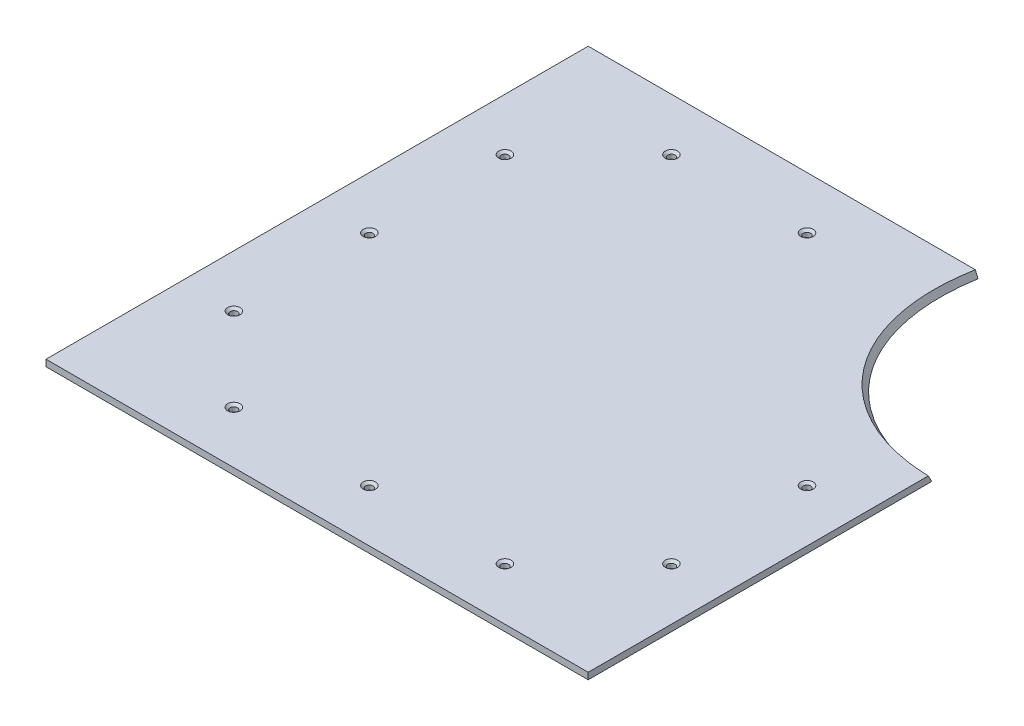
ISO-10303-21;
HEADER;
FILE_DESCRIPTION(('STEP AP214'),'2;1');
FILE_NAME('part.step','',(''),(''),'','','');
FILE_SCHEMA(('AUTOMOTIVE_DESIGN { 1 0 10303 214 1 1 1 1 }'));
ENDSEC;
DATA;
#1=APPLICATION_CONTEXT('core data for automotive mechanical design processes');
#2=APPLICATION_PROTOCOL_DEFINITION('international standard','automotive_design',2000,#1);
#3=PRODUCT_CONTEXT('',#1,'mechanical');
#4=PRODUCT('Part','Part','',(#3));
#5=PRODUCT_RELATED_PRODUCT_CATEGORY('part','',(#4));
#6=PRODUCT_DEFINITION_FORMATION('','',#4);
#7=PRODUCT_DEFINITION_CONTEXT('part definition',#1,'design');
#8=PRODUCT_DEFINITION('design','',#6,#7);
#9=PRODUCT_DEFINITION_SHAPE('','',#8);
#10=(LENGTH_UNIT() NAMED_UNIT(*) SI_UNIT(.MILLI.,.METRE.));
#11=(NAMED_UNIT(*) PLANE_ANGLE_UNIT() SI_UNIT($,.RADIAN.));
#12=(NAMED_UNIT(*) SI_UNIT($,.STERADIAN.) SOLID_ANGLE_UNIT());
#13=UNCERTAINTY_MEASURE_WITH_UNIT(LENGTH_MEASURE(1.E-05),#10,'distance_accuracy_value','');
#14=(GEOMETRIC_REPRESENTATION_CONTEXT(3) GLOBAL_UNCERTAINTY_ASSIGNED_CONTEXT((#13)) GLOBAL_UNIT_ASSIGNED_CONTEXT((#10,
#11,#12)) REPRESENTATION_CONTEXT('',''));
#15=CARTESIAN_POINT('',(0.,0.,0.));
#16=DIRECTION('',(0.,0.,1.));
#17=DIRECTION('',(1.,0.,0.));
#18=AXIS2_PLACEMENT_3D('',#15,#16,#17);
#19=CARTESIAN_POINT('',(65.821179,76.933679,65.821179));
#20=DIRECTION('',(1.,0.,0.));
#21=DIRECTION('',(0.,0.,1.));
#22=AXIS2_PLACEMENT_3D('',#19,#20,#21);
#23=PLANE('',#22);
#24=CARTESIAN_POINT('',(65.821179,99.3686619114965,-55.2144094068485));
#25=DIRECTION('',(1.,0.,0.));
#26=DIRECTION('',(0.,-0.892228166379723,-0.451584874767388));
#27=AXIS2_PLACEMENT_3D('',#24,#25,#26);
#28=ELLIPSE('',#27,110.282499709764,44.45);
#29=CARTESIAN_POINT('',(65.821179,76.933679,-16.7647949382659));
#30=VERTEX_POINT('',#29);
#31=CARTESIAN_POINT('',(65.821179,75.346179,-17.5943327986421));
#32=VERTEX_POINT('',#31);
#33=EDGE_CURVE('E46',#30,#32,#28,.T.);
#34=ORIENTED_EDGE('',*,*,#33,.F.);
#35=DIRECTION('',(0.,0.,1.));
#36=VECTOR('',#35,1.);
#37=CARTESIAN_POINT('',(65.821179,76.933679,65.821179));
#38=LINE('',#37,#36);
#39=CARTESIAN_POINT('',(65.821179,76.933679,65.821179));
#40=VERTEX_POINT('',#39);
#41=EDGE_CURVE('E74',#30,#40,#38,.T.);
#42=ORIENTED_EDGE('',*,*,#41,.T.);
#43=DIRECTION('',(0.,-1.,0.));
#44=VECTOR('',#43,1.);
#45=CARTESIAN_POINT('',(65.821179,76.933679,65.821179));
#46=LINE('',#45,#44);
#47=CARTESIAN_POINT('',(65.821179,75.346179,65.821179));
#48=VERTEX_POINT('',#47);
#49=EDGE_CURVE('E106',#40,#48,#46,.T.);
#50=ORIENTED_EDGE('',*,*,#49,.T.);
#51=DIRECTION('',(0.,0.,1.));
#52=VECTOR('',#51,1.);
#53=CARTESIAN_POINT('',(65.821179,75.346179,65.821179));
#54=LINE('',#53,#52);
#55=EDGE_CURVE('E113',#32,#48,#54,.T.);
#56=ORIENTED_EDGE('',*,*,#55,.F.);
#57=EDGE_LOOP('',(#34,#42,#50,#56));
#58=FACE_BOUND('',#57,.T.);
#59=ADVANCED_FACE('F32',(#58),#23,.T.);
#60=CARTESIAN_POINT('',(65.821179,76.933679,-65.821179));
#61=DIRECTION('',(0.,0.,-1.));
#62=DIRECTION('',(1.,0.,0.));
#63=AXIS2_PLACEMENT_3D('',#60,#61,#62);
#64=PLANE('',#63);
#65=CARTESIAN_POINT('',(76.165561457065,78.4121172748222,-65.821179));
#66=DIRECTION('',(0.,0.,-1.));
#67=DIRECTION('',(0.442624526559217,-0.896707047194472,0.));
#68=AXIS2_PLACEMENT_3D('',#65,#66,#67);
#69=ELLIPSE('',#68,107.554363776842,44.45);
#70=CARTESIAN_POINT('',(28.8239635311147,75.346179,-65.821179));
#71=VERTEX_POINT('',#70);
#72=CARTESIAN_POINT('',(28.1820681832988,76.933679,-65.821179));
#73=VERTEX_POINT('',#72);
#74=EDGE_CURVE('E84',#71,#73,#69,.T.);
#75=ORIENTED_EDGE('',*,*,#74,.F.);
#76=DIRECTION('',(1.,0.,0.));
#77=VECTOR('',#76,1.);
#78=CARTESIAN_POINT('',(65.821179,75.346179,-65.821179));
#79=LINE('',#78,#77);
#80=CARTESIAN_POINT('',(-65.821179,75.346179,-65.821179));
#81=VERTEX_POINT('',#80);
#82=EDGE_CURVE('E90',#81,#71,#79,.T.);
#83=ORIENTED_EDGE('',*,*,#82,.F.);
#84=DIRECTION('',(0.,-1.,0.));
#85=VECTOR('',#84,1.);
#86=CARTESIAN_POINT('',(-65.821179,76.933679,-65.821179));
#87=LINE('',#86,#85);
#88=CARTESIAN_POINT('',(-65.821179,76.933679,-65.821179));
#89=VERTEX_POINT('',#88);
#90=EDGE_CURVE('E39',#89,#81,#87,.T.);
#91=ORIENTED_EDGE('',*,*,#90,.F.);
#92=DIRECTION('',(1.,0.,0.));
#93=VECTOR('',#92,1.);
#94=CARTESIAN_POINT('',(65.821179,76.933679,-65.821179));
#95=LINE('',#94,#93);
#96=EDGE_CURVE('E92',#89,#73,#95,.T.);
#97=ORIENTED_EDGE('',*,*,#96,.T.);
#98=EDGE_LOOP('',(#75,#83,#91,#97));
#99=FACE_BOUND('',#98,.T.);
#100=ADVANCED_FACE('F89',(#99),#64,.T.);
#101=CARTESIAN_POINT('',(-65.821179,76.933679,65.821179));
#102=DIRECTION('',(-1.,0.,0.));
#103=DIRECTION('',(0.,0.,-1.));
#104=AXIS2_PLACEMENT_3D('',#101,#102,#103);
#105=PLANE('',#104);
#106=DIRECTION('',(0.,0.,-1.));
#107=VECTOR('',#106,1.);
#108=CARTESIAN_POINT('',(-65.821179,75.346179,65.821179));
#109=LINE('',#108,#107);
#110=CARTESIAN_POINT('',(-65.821179,75.346179,65.821179));
#111=VERTEX_POINT('',#110);
#112=EDGE_CURVE('E96',#111,#81,#109,.T.);
#113=ORIENTED_EDGE('',*,*,#112,.F.);
#114=DIRECTION('',(0.,-1.,0.));
#115=VECTOR('',#114,1.);
#116=CARTESIAN_POINT('',(-65.821179,76.933679,65.821179));
#117=LINE('',#116,#115);
#118=CARTESIAN_POINT('',(-65.821179,76.933679,65.821179));
#119=VERTEX_POINT('',#118);
#120=EDGE_CURVE('E105',#119,#111,#117,.T.);
#121=ORIENTED_EDGE('',*,*,#120,.F.);
#122=DIRECTION('',(0.,0.,-1.));
#123=VECTOR('',#122,1.);
#124=CARTESIAN_POINT('',(-65.821179,76.933679,65.821179));
#125=LINE('',#124,#123);
#126=EDGE_CURVE('E108',#119,#89,#125,.T.);
#127=ORIENTED_EDGE('',*,*,#126,.T.);
#128=ORIENTED_EDGE('',*,*,#90,.T.);
#129=EDGE_LOOP('',(#113,#121,#127,#128));
#130=FACE_BOUND('',#129,.T.);
#131=ADVANCED_FACE('F120',(#130),#105,.T.);
#132=CARTESIAN_POINT('',(65.821179,76.933679,65.821179));
#133=DIRECTION('',(0.,0.,1.));
#134=DIRECTION('',(-1.,0.,0.));
#135=AXIS2_PLACEMENT_3D('',#132,#133,#134);
#136=PLANE('',#135);
#137=DIRECTION('',(-1.,0.,0.));
#138=VECTOR('',#137,1.);
#139=CARTESIAN_POINT('',(65.821179,75.346179,65.821179));
#140=LINE('',#139,#138);
#141=EDGE_CURVE('E100',#48,#111,#140,.T.);
#142=ORIENTED_EDGE('',*,*,#141,.F.);
#143=ORIENTED_EDGE('',*,*,#49,.F.);
#144=DIRECTION('',(-1.,0.,0.));
#145=VECTOR('',#144,1.);
#146=CARTESIAN_POINT('',(65.821179,76.933679,65.821179));
#147=LINE('',#146,#145);
#148=EDGE_CURVE('E98',#40,#119,#147,.T.);
#149=ORIENTED_EDGE('',*,*,#148,.T.);
#150=ORIENTED_EDGE('',*,*,#120,.T.);
#151=EDGE_LOOP('',(#142,#143,#149,#150));
#152=FACE_BOUND('',#151,.T.);
#153=ADVANCED_FACE('F116',(#152),#136,.T.);
#154=CARTESIAN_POINT('',(65.821179,76.933679,-65.821179));
#155=DIRECTION('',(0.,1.,0.));
#156=DIRECTION('',(0.,0.,-1.));
#157=AXIS2_PLACEMENT_3D('',#154,#155,#156);
#158=PLANE('',#157);
#159=CARTESIAN_POINT('',(76.8953349583302,76.933679,-66.5694633384063));
#160=DIRECTION('',(0.,1.,0.));
#161=DIRECTION('',(0.698196395740358,0.,-0.715906273876108));
#162=AXIS2_PLACEMENT_3D('',#159,#160,#161);
#163=ELLIPSE('',#162,54.4366628705828,44.45);
#164=EDGE_CURVE('E132',#73,#30,#163,.T.);
#165=ORIENTED_EDGE('',*,*,#164,.F.);
#166=ORIENTED_EDGE('',*,*,#96,.F.);
#167=ORIENTED_EDGE('',*,*,#126,.F.);
#168=ORIENTED_EDGE('',*,*,#148,.F.);
#169=ORIENTED_EDGE('',*,*,#41,.F.);
#170=EDGE_LOOP('',(#165,#166,#167,#168,#169));
#171=FACE_BOUND('',#170,.T.);
#172=CARTESIAN_POINT('',(-53.1211790000003,76.933679,32.9105894999995));
#173=DIRECTION('',(0.,1.,0.));
#174=DIRECTION('',(0.,0.,-1.));
#175=AXIS2_PLACEMENT_3D('',#172,#173,#174);
#176=CIRCLE('',#175,1.5113);
#177=CARTESIAN_POINT('',(-53.1211790000003,76.933679,31.3992894999995));
#178=VERTEX_POINT('',#177);
#179=EDGE_CURVE('E223',#178,#178,#176,.T.);
#180=ORIENTED_EDGE('',*,*,#179,.F.);
#181=EDGE_LOOP('',(#180));
#182=FACE_BOUND('',#181,.T.);
#183=CARTESIAN_POINT('',(-53.121179,76.933679,-5.54508773728232E-13));
#184=DIRECTION('',(0.,1.,0.));
#185=DIRECTION('',(0.,0.,-1.));
#186=AXIS2_PLACEMENT_3D('',#183,#184,#185);
#187=CIRCLE('',#186,1.5113);
#188=CARTESIAN_POINT('',(-53.121179,76.933679,-1.51130000000055));
#189=VERTEX_POINT('',#188);
#190=EDGE_CURVE('E214',#189,#189,#187,.T.);
#191=ORIENTED_EDGE('',*,*,#190,.F.);
#192=EDGE_LOOP('',(#191));
#193=FACE_BOUND('',#192,.T.);
#194=CARTESIAN_POINT('',(-53.1211789999996,76.933679,-32.9105895000006));
#195=DIRECTION('',(0.,1.,0.));
#196=DIRECTION('',(0.,0.,-1.));
#197=AXIS2_PLACEMENT_3D('',#194,#195,#196);
#198=CIRCLE('',#197,1.5113);
#199=CARTESIAN_POINT('',(-53.1211789999996,76.933679,-34.4218895000006));
#200=VERTEX_POINT('',#199);
#201=EDGE_CURVE('E205',#200,#200,#198,.T.);
#202=ORIENTED_EDGE('',*,*,#201,.F.);
#203=EDGE_LOOP('',(#202));
#204=FACE_BOUND('',#203,.T.);
#205=CARTESIAN_POINT('',(32.9105894999996,76.933679,53.1211790000002));
#206=DIRECTION('',(0.,1.,0.));
#207=DIRECTION('',(0.,0.,-1.));
#208=AXIS2_PLACEMENT_3D('',#205,#206,#207);
#209=CIRCLE('',#208,1.5113);
#210=CARTESIAN_POINT('',(32.9105894999996,76.933679,51.6098790000002));
#211=VERTEX_POINT('',#210);
#212=EDGE_CURVE('E196',#211,#211,#209,.T.);
#213=ORIENTED_EDGE('',*,*,#212,.F.);
#214=EDGE_LOOP('',(#213));
#215=FACE_BOUND('',#214,.T.);
#216=CARTESIAN_POINT('',(-3.69037061127219E-13,76.933679,53.121179));
#217=DIRECTION('',(0.,1.,0.));
#218=DIRECTION('',(0.,0.,-1.));
#219=AXIS2_PLACEMENT_3D('',#216,#217,#218);
#220=CIRCLE('',#219,1.5113);
#221=CARTESIAN_POINT('',(-3.69037061127219E-13,76.933679,51.609879));
#222=VERTEX_POINT('',#221);
#223=EDGE_CURVE('E187',#222,#222,#220,.T.);
#224=ORIENTED_EDGE('',*,*,#223,.F.);
#225=EDGE_LOOP('',(#224));
#226=FACE_BOUND('',#225,.T.);
#227=CARTESIAN_POINT('',(-32.9105895000004,76.933679,53.1211789999997));
#228=DIRECTION('',(0.,1.,0.));
#229=DIRECTION('',(0.,0.,-1.));
#230=AXIS2_PLACEMENT_3D('',#227,#228,#229);
#231=CIRCLE('',#230,1.5113);
#232=CARTESIAN_POINT('',(-32.9105895000004,76.933679,51.6098789999997));
#233=VERTEX_POINT('',#232);
#234=EDGE_CURVE('E178',#233,#233,#231,.T.);
#235=ORIENTED_EDGE('',*,*,#234,.F.);
#236=EDGE_LOOP('',(#235));
#237=FACE_BOUND('',#236,.T.);
#238=CARTESIAN_POINT('',(53.121179,76.933679,1.83565348526206E-13));
#239=DIRECTION('',(0.,1.,0.));
#240=DIRECTION('',(0.,0.,-1.));
#241=AXIS2_PLACEMENT_3D('',#238,#239,#240);
#242=CIRCLE('',#241,1.5113);
#243=CARTESIAN_POINT('',(53.121179,76.933679,-1.51129999999982));
#244=VERTEX_POINT('',#243);
#245=EDGE_CURVE('E169',#244,#244,#242,.T.);
#246=ORIENTED_EDGE('',*,*,#245,.F.);
#247=EDGE_LOOP('',(#246));
#248=FACE_BOUND('',#247,.T.);
#249=CARTESIAN_POINT('',(53.1211789999998,76.933679,32.9105895000002));
#250=DIRECTION('',(0.,1.,0.));
#251=DIRECTION('',(0.,0.,-1.));
#252=AXIS2_PLACEMENT_3D('',#249,#250,#251);
#253=CIRCLE('',#252,1.5113);
#254=CARTESIAN_POINT('',(53.1211789999998,76.933679,31.3992895000002));
#255=VERTEX_POINT('',#254);
#256=EDGE_CURVE('E160',#255,#255,#253,.T.);
#257=ORIENTED_EDGE('',*,*,#256,.F.);
#258=EDGE_LOOP('',(#257));
#259=FACE_BOUND('',#258,.T.);
#260=CARTESIAN_POINT('',(-32.9105895,76.933679,-53.121179));
#261=DIRECTION('',(0.,1.,0.));
#262=DIRECTION('',(0.,0.,-1.));
#263=AXIS2_PLACEMENT_3D('',#260,#261,#262);
#264=CIRCLE('',#263,1.5113);
#265=CARTESIAN_POINT('',(-32.9105895,76.933679,-54.632479));
#266=VERTEX_POINT('',#265);
#267=EDGE_CURVE('E151',#266,#266,#264,.T.);
#268=ORIENTED_EDGE('',*,*,#267,.F.);
#269=EDGE_LOOP('',(#268));
#270=FACE_BOUND('',#269,.T.);
#271=CARTESIAN_POINT('',(0.,76.933679,-53.121179));
#272=DIRECTION('',(0.,1.,0.));
#273=DIRECTION('',(0.,0.,-1.));
#274=AXIS2_PLACEMENT_3D('',#271,#272,#273);
#275=CIRCLE('',#274,1.5113);
#276=CARTESIAN_POINT('',(0.,76.933679,-54.632479));
#277=VERTEX_POINT('',#276);
#278=EDGE_CURVE('E142',#277,#277,#275,.T.);
#279=ORIENTED_EDGE('',*,*,#278,.F.);
#280=EDGE_LOOP('',(#279));
#281=FACE_BOUND('',#280,.T.);
#282=ADVANCED_FACE('F127',(#171,#182,#193,#204,#215,#226,#237,#248,#259,#270,#281),#158,.T.);
#283=CARTESIAN_POINT('',(65.821179,75.346179,-65.821179));
#284=DIRECTION('',(0.,1.,0.));
#285=DIRECTION('',(0.,0.,-1.));
#286=AXIS2_PLACEMENT_3D('',#283,#284,#285);
#287=PLANE('',#286);
#288=CARTESIAN_POINT('',(-53.1211790000003,75.346179,32.9105894999995));
#289=DIRECTION('',(0.,1.,0.));
#290=DIRECTION('',(0.,0.,-1.));
#291=AXIS2_PLACEMENT_3D('',#288,#289,#290);
#292=CIRCLE('',#291,0.889000000000001);
#293=CARTESIAN_POINT('',(-53.1211790000003,75.346179,32.0215894999995));
#294=VERTEX_POINT('',#293);
#295=EDGE_CURVE('E217',#294,#294,#292,.T.);
#296=ORIENTED_EDGE('',*,*,#295,.T.);
#297=EDGE_LOOP('',(#296));
#298=FACE_BOUND('',#297,.T.);
#299=CARTESIAN_POINT('',(-53.121179,75.346179,-5.54508773728232E-13));
#300=DIRECTION('',(0.,1.,0.));
#301=DIRECTION('',(0.,0.,-1.));
#302=AXIS2_PLACEMENT_3D('',#299,#300,#301);
#303=CIRCLE('',#302,0.889000000000001);
#304=CARTESIAN_POINT('',(-53.121179,75.346179,-0.889000000000556));
#305=VERTEX_POINT('',#304);
#306=EDGE_CURVE('E208',#305,#305,#303,.T.);
#307=ORIENTED_EDGE('',*,*,#306,.T.);
#308=EDGE_LOOP('',(#307));
#309=FACE_BOUND('',#308,.T.);
#310=CARTESIAN_POINT('',(-53.1211789999996,75.346179,-32.9105895000006));
#311=DIRECTION('',(0.,1.,0.));
#312=DIRECTION('',(0.,0.,-1.));
#313=AXIS2_PLACEMENT_3D('',#310,#311,#312);
#314=CIRCLE('',#313,0.889000000000001);
#315=CARTESIAN_POINT('',(-53.1211789999996,75.346179,-33.7995895000006));
#316=VERTEX_POINT('',#315);
#317=EDGE_CURVE('E199',#316,#316,#314,.T.);
#318=ORIENTED_EDGE('',*,*,#317,.T.);
#319=EDGE_LOOP('',(#318));
#320=FACE_BOUND('',#319,.T.);
#321=CARTESIAN_POINT('',(32.9105894999996,75.346179,53.1211790000002));
#322=DIRECTION('',(0.,1.,0.));
#323=DIRECTION('',(0.,0.,-1.));
#324=AXIS2_PLACEMENT_3D('',#321,#322,#323);
#325=CIRCLE('',#324,0.889000000000001);
#326=CARTESIAN_POINT('',(32.9105894999996,75.346179,52.2321790000002));
#327=VERTEX_POINT('',#326);
#328=EDGE_CURVE('E190',#327,#327,#325,.T.);
#329=ORIENTED_EDGE('',*,*,#328,.T.);
#330=EDGE_LOOP('',(#329));
#331=FACE_BOUND('',#330,.T.);
#332=CARTESIAN_POINT('',(-3.69037061127219E-13,75.346179,53.121179));
#333=DIRECTION('',(0.,1.,0.));
#334=DIRECTION('',(0.,0.,-1.));
#335=AXIS2_PLACEMENT_3D('',#332,#333,#334);
#336=CIRCLE('',#335,0.889);
#337=CARTESIAN_POINT('',(-3.69037061127219E-13,75.346179,52.232179));
#338=VERTEX_POINT('',#337);
#339=EDGE_CURVE('E181',#338,#338,#336,.T.);
#340=ORIENTED_EDGE('',*,*,#339,.T.);
#341=EDGE_LOOP('',(#340));
#342=FACE_BOUND('',#341,.T.);
#343=CARTESIAN_POINT('',(-32.9105895000004,75.346179,53.1211789999997));
#344=DIRECTION('',(0.,1.,0.));
#345=DIRECTION('',(0.,0.,-1.));
#346=AXIS2_PLACEMENT_3D('',#343,#344,#345);
#347=CIRCLE('',#346,0.889000000000001);
#348=CARTESIAN_POINT('',(-32.9105895000004,75.346179,52.2321789999997));
#349=VERTEX_POINT('',#348);
#350=EDGE_CURVE('E172',#349,#349,#347,.T.);
#351=ORIENTED_EDGE('',*,*,#350,.T.);
#352=EDGE_LOOP('',(#351));
#353=FACE_BOUND('',#352,.T.);
#354=CARTESIAN_POINT('',(53.121179,75.346179,1.83565348526206E-13));
#355=DIRECTION('',(0.,1.,0.));
#356=DIRECTION('',(0.,0.,-1.));
#357=AXIS2_PLACEMENT_3D('',#354,#355,#356);
#358=CIRCLE('',#357,0.889000000000001);
#359=CARTESIAN_POINT('',(53.121179,75.346179,-0.888999999999818));
#360=VERTEX_POINT('',#359);
#361=EDGE_CURVE('E163',#360,#360,#358,.T.);
#362=ORIENTED_EDGE('',*,*,#361,.T.);
#363=EDGE_LOOP('',(#362));
#364=FACE_BOUND('',#363,.T.);
#365=CARTESIAN_POINT('',(53.1211789999998,75.346179,32.9105895000002));
#366=DIRECTION('',(0.,1.,0.));
#367=DIRECTION('',(0.,0.,-1.));
#368=AXIS2_PLACEMENT_3D('',#365,#366,#367);
#369=CIRCLE('',#368,0.889000000000001);
#370=CARTESIAN_POINT('',(53.1211789999998,75.346179,32.0215895000002));
#371=VERTEX_POINT('',#370);
#372=EDGE_CURVE('E154',#371,#371,#369,.T.);
#373=ORIENTED_EDGE('',*,*,#372,.T.);
#374=EDGE_LOOP('',(#373));
#375=FACE_BOUND('',#374,.T.);
#376=CARTESIAN_POINT('',(-32.9105895,75.346179,-53.121179));
#377=DIRECTION('',(0.,1.,0.));
#378=DIRECTION('',(0.,0.,-1.));
#379=AXIS2_PLACEMENT_3D('',#376,#377,#378);
#380=CIRCLE('',#379,0.889000000000001);
#381=CARTESIAN_POINT('',(-32.9105895,75.346179,-54.010179));
#382=VERTEX_POINT('',#381);
#383=EDGE_CURVE('E145',#382,#382,#380,.T.);
#384=ORIENTED_EDGE('',*,*,#383,.T.);
#385=EDGE_LOOP('',(#384));
#386=FACE_BOUND('',#385,.T.);
#387=CARTESIAN_POINT('',(0.,75.346179,-53.121179));
#388=DIRECTION('',(0.,1.,0.));
#389=DIRECTION('',(0.,0.,-1.));
#390=AXIS2_PLACEMENT_3D('',#387,#388,#389);
#391=CIRCLE('',#390,0.889);
#392=CARTESIAN_POINT('',(0.,75.346179,-54.010179));
#393=VERTEX_POINT('',#392);
#394=EDGE_CURVE('E114',#393,#393,#391,.T.);
#395=ORIENTED_EDGE('',*,*,#394,.T.);
#396=EDGE_LOOP('',(#395));
#397=FACE_BOUND('',#396,.T.);
#398=ORIENTED_EDGE('',*,*,#82,.T.);
#399=CARTESIAN_POINT('',(77.6789425346408,75.346179,-67.3729472629298));
#400=DIRECTION('',(0.,1.,0.));
#401=DIRECTION('',(0.698196395740358,0.,-0.715906273876108));
#402=AXIS2_PLACEMENT_3D('',#399,#400,#401);
#403=ELLIPSE('',#402,54.4366628705828,44.45);
#404=EDGE_CURVE('E11',#71,#32,#403,.T.);
#405=ORIENTED_EDGE('',*,*,#404,.T.);
#406=ORIENTED_EDGE('',*,*,#55,.T.);
#407=ORIENTED_EDGE('',*,*,#141,.T.);
#408=ORIENTED_EDGE('',*,*,#112,.T.);
#409=EDGE_LOOP('',(#398,#405,#406,#407,#408));
#410=FACE_BOUND('',#409,.T.);
#411=ADVANCED_FACE('F94',(#298,#309,#320,#331,#342,#353,#364,#375,#386,#397,#410),#287,.F.);
#412=CARTESIAN_POINT('',(0.,76.933679,-53.121179));
#413=DIRECTION('',(0.,1.,0.));
#414=DIRECTION('',(0.,0.,-1.));
#415=AXIS2_PLACEMENT_3D('',#412,#413,#414);
#416=CYLINDRICAL_SURFACE('',#415,0.888999999999998);
#417=ORIENTED_EDGE('',*,*,#394,.F.);
#418=EDGE_LOOP('',(#417));
#419=FACE_BOUND('',#418,.T.);
#420=CARTESIAN_POINT('',(0.,76.4115072995184,-53.121179));
#421=DIRECTION('',(0.,1.,0.));
#422=DIRECTION('',(0.,0.,-1.));
#423=AXIS2_PLACEMENT_3D('',#420,#421,#422);
#424=CIRCLE('',#423,0.888999999999997);
#425=CARTESIAN_POINT('',(0.,76.4115072995184,-54.010179));
#426=VERTEX_POINT('',#425);
#427=EDGE_CURVE('E139',#426,#426,#424,.T.);
#428=ORIENTED_EDGE('',*,*,#427,.T.);
#429=EDGE_LOOP('',(#428));
#430=FACE_BOUND('',#429,.T.);
#431=ADVANCED_FACE('F253',(#419,#430),#416,.F.);
#432=CARTESIAN_POINT('',(0.,76.933679,-53.121179));
#433=DIRECTION('',(0.,1.,0.));
#434=DIRECTION('',(0.,0.,-1.));
#435=AXIS2_PLACEMENT_3D('',#432,#433,#434);
#436=CONICAL_SURFACE('',#435,1.5113,0.87266462599717);
#437=ORIENTED_EDGE('',*,*,#427,.F.);
#438=EDGE_LOOP('',(#437));
#439=FACE_BOUND('',#438,.T.);
#440=ORIENTED_EDGE('',*,*,#278,.T.);
#441=EDGE_LOOP('',(#440));
#442=FACE_BOUND('',#441,.T.);
#443=ADVANCED_FACE('F250',(#439,#442),#436,.F.);
#444=CARTESIAN_POINT('',(-32.9105895,76.933679,-53.121179));
#445=DIRECTION('',(0.,1.,0.));
#446=DIRECTION('',(0.,0.,-1.));
#447=AXIS2_PLACEMENT_3D('',#444,#445,#446);
#448=CYLINDRICAL_SURFACE('',#447,0.888999999999997);
#449=ORIENTED_EDGE('',*,*,#383,.F.);
#450=EDGE_LOOP('',(#449));
#451=FACE_BOUND('',#450,.T.);
#452=CARTESIAN_POINT('',(-32.9105895,76.4115072995184,-53.121179));
#453=DIRECTION('',(0.,1.,0.));
#454=DIRECTION('',(0.,0.,-1.));
#455=AXIS2_PLACEMENT_3D('',#452,#453,#454);
#456=CIRCLE('',#455,0.888999999999994);
#457=CARTESIAN_POINT('',(-32.9105895,76.4115072995184,-54.010179));
#458=VERTEX_POINT('',#457);
#459=EDGE_CURVE('E148',#458,#458,#456,.T.);
#460=ORIENTED_EDGE('',*,*,#459,.T.);
#461=EDGE_LOOP('',(#460));
#462=FACE_BOUND('',#461,.T.);
#463=ADVANCED_FACE('F252',(#451,#462),#448,.F.);
#464=CARTESIAN_POINT('',(-32.9105895,76.933679,-53.121179));
#465=DIRECTION('',(0.,1.,0.));
#466=DIRECTION('',(0.,0.,-1.));
#467=AXIS2_PLACEMENT_3D('',#464,#465,#466);
#468=CONICAL_SURFACE('',#467,1.5113,0.872664625997172);
#469=ORIENTED_EDGE('',*,*,#459,.F.);
#470=EDGE_LOOP('',(#469));
#471=FACE_BOUND('',#470,.T.);
#472=ORIENTED_EDGE('',*,*,#267,.T.);
#473=EDGE_LOOP('',(#472));
#474=FACE_BOUND('',#473,.T.);
#475=ADVANCED_FACE('F260',(#471,#474),#468,.F.);
#476=CARTESIAN_POINT('',(53.1211789999998,76.933679,32.9105895000002));
#477=DIRECTION('',(0.,1.,0.));
#478=DIRECTION('',(0.,0.,-1.));
#479=AXIS2_PLACEMENT_3D('',#476,#477,#478);
#480=CYLINDRICAL_SURFACE('',#479,0.888999999999997);
#481=ORIENTED_EDGE('',*,*,#372,.F.);
#482=EDGE_LOOP('',(#481));
#483=FACE_BOUND('',#482,.T.);
#484=CARTESIAN_POINT('',(53.1211789999998,76.4115072995184,32.9105895000002));
#485=DIRECTION('',(0.,1.,0.));
#486=DIRECTION('',(0.,0.,-1.));
#487=AXIS2_PLACEMENT_3D('',#484,#485,#486);
#488=CIRCLE('',#487,0.888999999999994);
#489=CARTESIAN_POINT('',(53.1211789999998,76.4115072995184,32.0215895000002));
#490=VERTEX_POINT('',#489);
#491=EDGE_CURVE('E157',#490,#490,#488,.T.);
#492=ORIENTED_EDGE('',*,*,#491,.T.);
#493=EDGE_LOOP('',(#492));
#494=FACE_BOUND('',#493,.T.);
#495=ADVANCED_FACE('F297',(#483,#494),#480,.F.);
#496=CARTESIAN_POINT('',(53.1211789999998,76.933679,32.9105895000002));
#497=DIRECTION('',(0.,1.,0.));
#498=DIRECTION('',(0.,0.,-1.));
#499=AXIS2_PLACEMENT_3D('',#496,#497,#498);
#500=CONICAL_SURFACE('',#499,1.5113,0.872664625997172);
#501=ORIENTED_EDGE('',*,*,#491,.F.);
#502=EDGE_LOOP('',(#501));
#503=FACE_BOUND('',#502,.T.);
#504=ORIENTED_EDGE('',*,*,#256,.T.);
#505=EDGE_LOOP('',(#504));
#506=FACE_BOUND('',#505,.T.);
#507=ADVANCED_FACE('F301',(#503,#506),#500,.F.);
#508=CARTESIAN_POINT('',(53.121179,76.933679,1.83565348526206E-13));
#509=DIRECTION('',(0.,1.,0.));
#510=DIRECTION('',(0.,0.,-1.));
#511=AXIS2_PLACEMENT_3D('',#508,#509,#510);
#512=CYLINDRICAL_SURFACE('',#511,0.888999999999997);
#513=ORIENTED_EDGE('',*,*,#361,.F.);
#514=EDGE_LOOP('',(#513));
#515=FACE_BOUND('',#514,.T.);
#516=CARTESIAN_POINT('',(53.121179,76.4115072995184,1.83565348526206E-13));
#517=DIRECTION('',(0.,1.,0.));
#518=DIRECTION('',(0.,0.,-1.));
#519=AXIS2_PLACEMENT_3D('',#516,#517,#518);
#520=CIRCLE('',#519,0.888999999999994);
#521=CARTESIAN_POINT('',(53.121179,76.4115072995184,-0.888999999999811));
#522=VERTEX_POINT('',#521);
#523=EDGE_CURVE('E166',#522,#522,#520,.T.);
#524=ORIENTED_EDGE('',*,*,#523,.T.);
#525=EDGE_LOOP('',(#524));
#526=FACE_BOUND('',#525,.T.);
#527=ADVANCED_FACE('F307',(#515,#526),#512,.F.);
#528=CARTESIAN_POINT('',(53.121179,76.933679,1.83565348526206E-13));
#529=DIRECTION('',(0.,1.,0.));
#530=DIRECTION('',(0.,0.,-1.));
#531=AXIS2_PLACEMENT_3D('',#528,#529,#530);
#532=CONICAL_SURFACE('',#531,1.5113,0.872664625997172);
#533=ORIENTED_EDGE('',*,*,#523,.F.);
#534=EDGE_LOOP('',(#533));
#535=FACE_BOUND('',#534,.T.);
#536=ORIENTED_EDGE('',*,*,#245,.T.);
#537=EDGE_LOOP('',(#536));
#538=FACE_BOUND('',#537,.T.);
#539=ADVANCED_FACE('F311',(#535,#538),#532,.F.);
#540=CARTESIAN_POINT('',(-32.9105895000004,76.933679,53.1211789999997));
#541=DIRECTION('',(0.,1.,0.));
#542=DIRECTION('',(0.,0.,-1.));
#543=AXIS2_PLACEMENT_3D('',#540,#541,#542);
#544=CYLINDRICAL_SURFACE('',#543,0.888999999999997);
#545=ORIENTED_EDGE('',*,*,#350,.F.);
#546=EDGE_LOOP('',(#545));
#547=FACE_BOUND('',#546,.T.);
#548=CARTESIAN_POINT('',(-32.9105895000004,76.4115072995184,53.1211789999997));
#549=DIRECTION('',(0.,1.,0.));
#550=DIRECTION('',(0.,0.,-1.));
#551=AXIS2_PLACEMENT_3D('',#548,#549,#550);
#552=CIRCLE('',#551,0.888999999999994);
#553=CARTESIAN_POINT('',(-32.9105895000004,76.4115072995184,52.2321789999997));
#554=VERTEX_POINT('',#553);
#555=EDGE_CURVE('E175',#554,#554,#552,.T.);
#556=ORIENTED_EDGE('',*,*,#555,.T.);
#557=EDGE_LOOP('',(#556));
#558=FACE_BOUND('',#557,.T.);
#559=ADVANCED_FACE('F315',(#547,#558),#544,.F.);
#560=CARTESIAN_POINT('',(-32.9105895000004,76.933679,53.1211789999997));
#561=DIRECTION('',(0.,1.,0.));
#562=DIRECTION('',(0.,0.,-1.));
#563=AXIS2_PLACEMENT_3D('',#560,#561,#562);
#564=CONICAL_SURFACE('',#563,1.5113,0.872664625997172);
#565=ORIENTED_EDGE('',*,*,#555,.F.);
#566=EDGE_LOOP('',(#565));
#567=FACE_BOUND('',#566,.T.);
#568=ORIENTED_EDGE('',*,*,#234,.T.);
#569=EDGE_LOOP('',(#568));
#570=FACE_BOUND('',#569,.T.);
#571=ADVANCED_FACE('F319',(#567,#570),#564,.F.);
#572=CARTESIAN_POINT('',(-3.69037061127219E-13,76.933679,53.121179));
#573=DIRECTION('',(0.,1.,0.));
#574=DIRECTION('',(0.,0.,-1.));
#575=AXIS2_PLACEMENT_3D('',#572,#573,#574);
#576=CYLINDRICAL_SURFACE('',#575,0.888999999999998);
#577=ORIENTED_EDGE('',*,*,#339,.F.);
#578=EDGE_LOOP('',(#577));
#579=FACE_BOUND('',#578,.T.);
#580=CARTESIAN_POINT('',(-3.69037061127219E-13,76.4115072995184,53.121179));
#581=DIRECTION('',(0.,1.,0.));
#582=DIRECTION('',(0.,0.,-1.));
#583=AXIS2_PLACEMENT_3D('',#580,#581,#582);
#584=CIRCLE('',#583,0.888999999999997);
#585=CARTESIAN_POINT('',(-3.69037061127219E-13,76.4115072995184,52.232179));
#586=VERTEX_POINT('',#585);
#587=EDGE_CURVE('E184',#586,#586,#584,.T.);
#588=ORIENTED_EDGE('',*,*,#587,.T.);
#589=EDGE_LOOP('',(#588));
#590=FACE_BOUND('',#589,.T.);
#591=ADVANCED_FACE('F323',(#579,#590),#576,.F.);
#592=CARTESIAN_POINT('',(-3.69037061127219E-13,76.933679,53.121179));
#593=DIRECTION('',(0.,1.,0.));
#594=DIRECTION('',(0.,0.,-1.));
#595=AXIS2_PLACEMENT_3D('',#592,#593,#594);
#596=CONICAL_SURFACE('',#595,1.5113,0.87266462599717);
#597=ORIENTED_EDGE('',*,*,#587,.F.);
#598=EDGE_LOOP('',(#597));
#599=FACE_BOUND('',#598,.T.);
#600=ORIENTED_EDGE('',*,*,#223,.T.);
#601=EDGE_LOOP('',(#600));
#602=FACE_BOUND('',#601,.T.);
#603=ADVANCED_FACE('F327',(#599,#602),#596,.F.);
#604=CARTESIAN_POINT('',(32.9105894999996,76.933679,53.1211790000002));
#605=DIRECTION('',(0.,1.,0.));
#606=DIRECTION('',(0.,0.,-1.));
#607=AXIS2_PLACEMENT_3D('',#604,#605,#606);
#608=CYLINDRICAL_SURFACE('',#607,0.888999999999997);
#609=ORIENTED_EDGE('',*,*,#328,.F.);
#610=EDGE_LOOP('',(#609));
#611=FACE_BOUND('',#610,.T.);
#612=CARTESIAN_POINT('',(32.9105894999996,76.4115072995184,53.1211790000002));
#613=DIRECTION('',(0.,1.,0.));
#614=DIRECTION('',(0.,0.,-1.));
#615=AXIS2_PLACEMENT_3D('',#612,#613,#614);
#616=CIRCLE('',#615,0.888999999999994);
#617=CARTESIAN_POINT('',(32.9105894999996,76.4115072995184,52.2321790000002));
#618=VERTEX_POINT('',#617);
#619=EDGE_CURVE('E193',#618,#618,#616,.T.);
#620=ORIENTED_EDGE('',*,*,#619,.T.);
#621=EDGE_LOOP('',(#620));
#622=FACE_BOUND('',#621,.T.);
#623=ADVANCED_FACE('F331',(#611,#622),#608,.F.);
#624=CARTESIAN_POINT('',(32.9105894999996,76.933679,53.1211790000002));
#625=DIRECTION('',(0.,1.,0.));
#626=DIRECTION('',(0.,0.,-1.));
#627=AXIS2_PLACEMENT_3D('',#624,#625,#626);
#628=CONICAL_SURFACE('',#627,1.5113,0.872664625997172);
#629=ORIENTED_EDGE('',*,*,#619,.F.);
#630=EDGE_LOOP('',(#629));
#631=FACE_BOUND('',#630,.T.);
#632=ORIENTED_EDGE('',*,*,#212,.T.);
#633=EDGE_LOOP('',(#632));
#634=FACE_BOUND('',#633,.T.);
#635=ADVANCED_FACE('F335',(#631,#634),#628,.F.);
#636=CARTESIAN_POINT('',(-53.1211789999996,76.933679,-32.9105895000006));
#637=DIRECTION('',(0.,1.,0.));
#638=DIRECTION('',(0.,0.,-1.));
#639=AXIS2_PLACEMENT_3D('',#636,#637,#638);
#640=CYLINDRICAL_SURFACE('',#639,0.888999999999997);
#641=ORIENTED_EDGE('',*,*,#317,.F.);
#642=EDGE_LOOP('',(#641));
#643=FACE_BOUND('',#642,.T.);
#644=CARTESIAN_POINT('',(-53.1211789999996,76.4115072995184,-32.9105895000006));
#645=DIRECTION('',(0.,1.,0.));
#646=DIRECTION('',(0.,0.,-1.));
#647=AXIS2_PLACEMENT_3D('',#644,#645,#646);
#648=CIRCLE('',#647,0.888999999999994);
#649=CARTESIAN_POINT('',(-53.1211789999996,76.4115072995184,-33.7995895000005));
#650=VERTEX_POINT('',#649);
#651=EDGE_CURVE('E202',#650,#650,#648,.T.);
#652=ORIENTED_EDGE('',*,*,#651,.T.);
#653=EDGE_LOOP('',(#652));
#654=FACE_BOUND('',#653,.T.);
#655=ADVANCED_FACE('F339',(#643,#654),#640,.F.);
#656=CARTESIAN_POINT('',(-53.1211789999996,76.933679,-32.9105895000006));
#657=DIRECTION('',(0.,1.,0.));
#658=DIRECTION('',(0.,0.,-1.));
#659=AXIS2_PLACEMENT_3D('',#656,#657,#658);
#660=CONICAL_SURFACE('',#659,1.5113,0.872664625997172);
#661=ORIENTED_EDGE('',*,*,#651,.F.);
#662=EDGE_LOOP('',(#661));
#663=FACE_BOUND('',#662,.T.);
#664=ORIENTED_EDGE('',*,*,#201,.T.);
#665=EDGE_LOOP('',(#664));
#666=FACE_BOUND('',#665,.T.);
#667=ADVANCED_FACE('F343',(#663,#666),#660,.F.);
#668=CARTESIAN_POINT('',(-53.121179,76.933679,-5.54508773728232E-13));
#669=DIRECTION('',(0.,1.,0.));
#670=DIRECTION('',(0.,0.,-1.));
#671=AXIS2_PLACEMENT_3D('',#668,#669,#670);
#672=CYLINDRICAL_SURFACE('',#671,0.888999999999997);
#673=ORIENTED_EDGE('',*,*,#306,.F.);
#674=EDGE_LOOP('',(#673));
#675=FACE_BOUND('',#674,.T.);
#676=CARTESIAN_POINT('',(-53.121179,76.4115072995184,-5.54508773728232E-13));
#677=DIRECTION('',(0.,1.,0.));
#678=DIRECTION('',(0.,0.,-1.));
#679=AXIS2_PLACEMENT_3D('',#676,#677,#678);
#680=CIRCLE('',#679,0.888999999999994);
#681=CARTESIAN_POINT('',(-53.121179,76.4115072995184,-0.889000000000549));
#682=VERTEX_POINT('',#681);
#683=EDGE_CURVE('E211',#682,#682,#680,.T.);
#684=ORIENTED_EDGE('',*,*,#683,.T.);
#685=EDGE_LOOP('',(#684));
#686=FACE_BOUND('',#685,.T.);
#687=ADVANCED_FACE('F347',(#675,#686),#672,.F.);
#688=CARTESIAN_POINT('',(-53.121179,76.933679,-5.54508773728232E-13));
#689=DIRECTION('',(0.,1.,0.));
#690=DIRECTION('',(0.,0.,-1.));
#691=AXIS2_PLACEMENT_3D('',#688,#689,#690);
#692=CONICAL_SURFACE('',#691,1.5113,0.872664625997172);
#693=ORIENTED_EDGE('',*,*,#683,.F.);
#694=EDGE_LOOP('',(#693));
#695=FACE_BOUND('',#694,.T.);
#696=ORIENTED_EDGE('',*,*,#190,.T.);
#697=EDGE_LOOP('',(#696));
#698=FACE_BOUND('',#697,.T.);
#699=ADVANCED_FACE('F351',(#695,#698),#692,.F.);
#700=CARTESIAN_POINT('',(-53.1211790000003,76.933679,32.9105894999995));
#701=DIRECTION('',(0.,1.,0.));
#702=DIRECTION('',(0.,0.,-1.));
#703=AXIS2_PLACEMENT_3D('',#700,#701,#702);
#704=CYLINDRICAL_SURFACE('',#703,0.888999999999997);
#705=ORIENTED_EDGE('',*,*,#295,.F.);
#706=EDGE_LOOP('',(#705));
#707=FACE_BOUND('',#706,.T.);
#708=CARTESIAN_POINT('',(-53.1211790000003,76.4115072995184,32.9105894999995));
#709=DIRECTION('',(0.,1.,0.));
#710=DIRECTION('',(0.,0.,-1.));
#711=AXIS2_PLACEMENT_3D('',#708,#709,#710);
#712=CIRCLE('',#711,0.888999999999994);
#713=CARTESIAN_POINT('',(-53.1211790000003,76.4115072995184,32.0215894999995));
#714=VERTEX_POINT('',#713);
#715=EDGE_CURVE('E220',#714,#714,#712,.T.);
#716=ORIENTED_EDGE('',*,*,#715,.T.);
#717=EDGE_LOOP('',(#716));
#718=FACE_BOUND('',#717,.T.);
#719=ADVANCED_FACE('F355',(#707,#718),#704,.F.);
#720=CARTESIAN_POINT('',(-53.1211790000003,76.933679,32.9105894999995));
#721=DIRECTION('',(0.,1.,0.));
#722=DIRECTION('',(0.,0.,-1.));
#723=AXIS2_PLACEMENT_3D('',#720,#721,#722);
#724=CONICAL_SURFACE('',#723,1.5113,0.872664625997172);
#725=ORIENTED_EDGE('',*,*,#715,.F.);
#726=EDGE_LOOP('',(#725));
#727=FACE_BOUND('',#726,.T.);
#728=ORIENTED_EDGE('',*,*,#179,.T.);
#729=EDGE_LOOP('',(#728));
#730=FACE_BOUND('',#729,.T.);
#731=ADVANCED_FACE('F228',(#727,#730),#724,.F.);
#732=CARTESIAN_POINT('',(31.6575466423522,168.580303053496,-20.184210321816));
#733=DIRECTION('',(0.403055789603803,-0.816545277686749,-0.413279372766564));
#734=DIRECTION('',(0.,0.451584874767388,-0.892228166379723));
#735=AXIS2_PLACEMENT_3D('',#732,#733,#734);
#736=CYLINDRICAL_SURFACE('',#735,44.45);
#737=ORIENTED_EDGE('',*,*,#164,.T.);
#738=ORIENTED_EDGE('',*,*,#33,.T.);
#739=ORIENTED_EDGE('',*,*,#404,.F.);
#740=ORIENTED_EDGE('',*,*,#74,.T.);
#741=EDGE_LOOP('',(#737,#738,#739,#740));
#742=FACE_BOUND('',#741,.T.);
#743=ADVANCED_FACE('F83',(#742),#736,.F.);
#744=CLOSED_SHELL('',(#59,#100,#131,#153,#282,#411,#431,#443,#463,#475,#495,#507,#527,#539,#559,
#571,#591,#603,#623,#635,#655,#667,#687,#699,#719,#731,#743));
#745=MANIFOLD_SOLID_BREP('B2',#744);
#746=ADVANCED_BREP_SHAPE_REPRESENTATION('',(#18,#745),#14);
#747=SHAPE_DEFINITION_REPRESENTATION(#9,#746);
ENDSEC;
END-ISO-10303-21;
